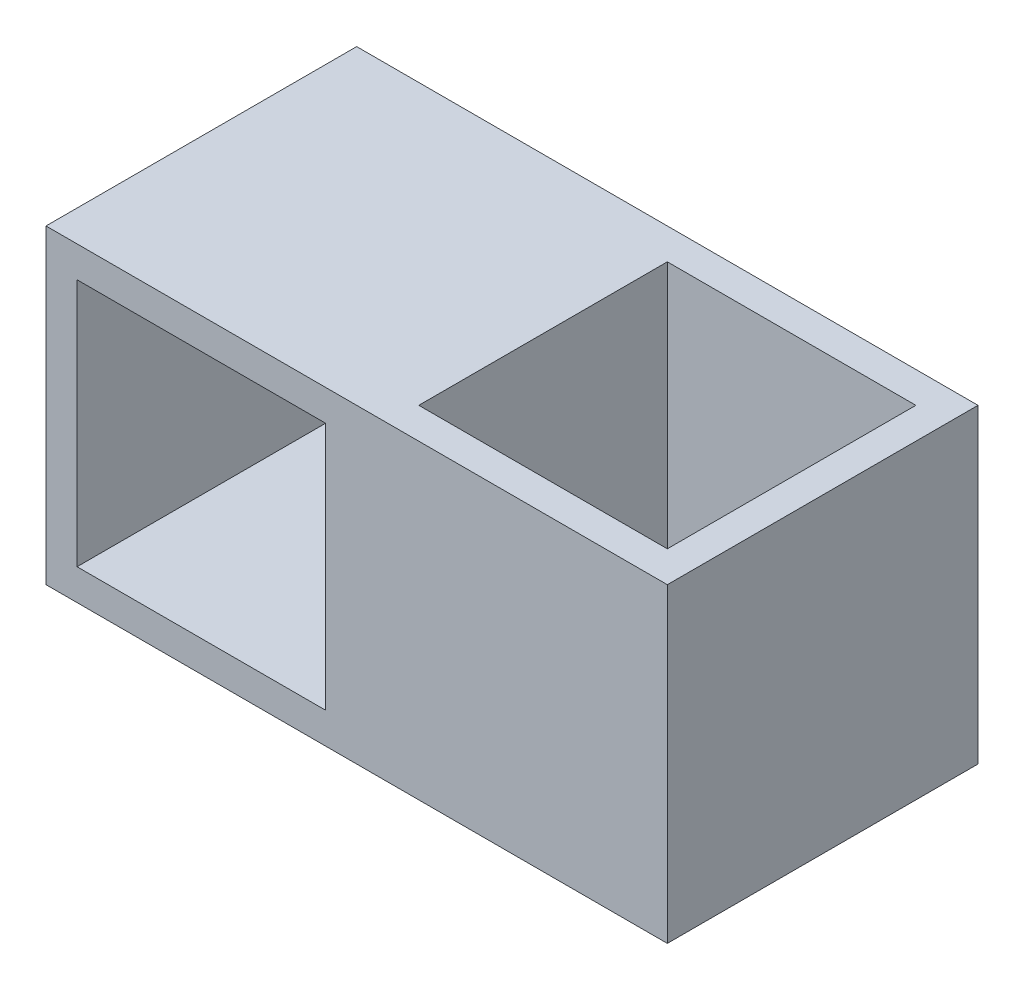
ISO-10303-21;
HEADER;
FILE_DESCRIPTION(('STEP AP214'),'2;1');
FILE_NAME('part.step','',(''),(''),'','','');
FILE_SCHEMA(('AUTOMOTIVE_DESIGN { 1 0 10303 214 1 1 1 1 }'));
ENDSEC;
DATA;
#1=APPLICATION_CONTEXT('core data for automotive mechanical design processes');
#2=APPLICATION_PROTOCOL_DEFINITION('international standard','automotive_design',2000,#1);
#3=PRODUCT_CONTEXT('',#1,'mechanical');
#4=PRODUCT('Part','Part','',(#3));
#5=PRODUCT_RELATED_PRODUCT_CATEGORY('part','',(#4));
#6=PRODUCT_DEFINITION_FORMATION('','',#4);
#7=PRODUCT_DEFINITION_CONTEXT('part definition',#1,'design');
#8=PRODUCT_DEFINITION('design','',#6,#7);
#9=PRODUCT_DEFINITION_SHAPE('','',#8);
#10=(LENGTH_UNIT() NAMED_UNIT(*) SI_UNIT(.MILLI.,.METRE.));
#11=(NAMED_UNIT(*) PLANE_ANGLE_UNIT() SI_UNIT($,.RADIAN.));
#12=(NAMED_UNIT(*) SI_UNIT($,.STERADIAN.) SOLID_ANGLE_UNIT());
#13=UNCERTAINTY_MEASURE_WITH_UNIT(LENGTH_MEASURE(1.E-05),#10,'distance_accuracy_value','');
#14=(GEOMETRIC_REPRESENTATION_CONTEXT(3) GLOBAL_UNCERTAINTY_ASSIGNED_CONTEXT((#13)) GLOBAL_UNIT_ASSIGNED_CONTEXT((#10,
#11,#12)) REPRESENTATION_CONTEXT('',''));
#15=CARTESIAN_POINT('',(0.,0.,0.));
#16=DIRECTION('',(0.,0.,1.));
#17=DIRECTION('',(1.,0.,0.));
#18=AXIS2_PLACEMENT_3D('',#15,#16,#17);
#19=CARTESIAN_POINT('',(-50.,-25.,50.));
#20=DIRECTION('',(1.,0.,0.));
#21=DIRECTION('',(0.,0.,-1.));
#22=AXIS2_PLACEMENT_3D('',#19,#20,#21);
#23=PLANE('',#22);
#24=DIRECTION('',(0.,-1.,0.));
#25=VECTOR('',#24,1.);
#26=CARTESIAN_POINT('',(-50.,-25.,0.));
#27=LINE('',#26,#25);
#28=CARTESIAN_POINT('',(-50.,25.,0.));
#29=VERTEX_POINT('',#28);
#30=CARTESIAN_POINT('',(-50.,-25.,0.));
#31=VERTEX_POINT('',#30);
#32=EDGE_CURVE('E218',#29,#31,#27,.T.);
#33=ORIENTED_EDGE('',*,*,#32,.T.);
#34=DIRECTION('',(0.,0.,-1.));
#35=VECTOR('',#34,1.);
#36=CARTESIAN_POINT('',(-50.,-25.,50.));
#37=LINE('',#36,#35);
#38=CARTESIAN_POINT('',(-50.,-25.,50.));
#39=VERTEX_POINT('',#38);
#40=EDGE_CURVE('E11',#39,#31,#37,.T.);
#41=ORIENTED_EDGE('',*,*,#40,.F.);
#42=DIRECTION('',(0.,-1.,0.));
#43=VECTOR('',#42,1.);
#44=CARTESIAN_POINT('',(-50.,-25.,50.));
#45=LINE('',#44,#43);
#46=CARTESIAN_POINT('',(-50.,25.,50.));
#47=VERTEX_POINT('',#46);
#48=EDGE_CURVE('E219',#47,#39,#45,.T.);
#49=ORIENTED_EDGE('',*,*,#48,.F.);
#50=DIRECTION('',(0.,0.,-1.));
#51=VECTOR('',#50,1.);
#52=CARTESIAN_POINT('',(-50.,25.,50.));
#53=LINE('',#52,#51);
#54=EDGE_CURVE('E233',#47,#29,#53,.T.);
#55=ORIENTED_EDGE('',*,*,#54,.T.);
#56=EDGE_LOOP('',(#33,#41,#49,#55));
#57=FACE_BOUND('',#56,.T.);
#58=ADVANCED_FACE('F39',(#57),#23,.F.);
#59=CARTESIAN_POINT('',(50.,-25.,50.));
#60=DIRECTION('',(0.,1.,0.));
#61=DIRECTION('',(-1.,0.,0.));
#62=AXIS2_PLACEMENT_3D('',#59,#60,#61);
#63=PLANE('',#62);
#64=DIRECTION('',(1.,0.,0.));
#65=VECTOR('',#64,1.);
#66=CARTESIAN_POINT('',(45.,-25.,5.));
#67=LINE('',#66,#65);
#68=CARTESIAN_POINT('',(5.00000000000002,-25.,4.99999999999999));
#69=VERTEX_POINT('',#68);
#70=CARTESIAN_POINT('',(45.,-25.,5.));
#71=VERTEX_POINT('',#70);
#72=EDGE_CURVE('E189',#69,#71,#67,.T.);
#73=ORIENTED_EDGE('',*,*,#72,.F.);
#74=DIRECTION('',(0.,0.,-1.));
#75=VECTOR('',#74,1.);
#76=CARTESIAN_POINT('',(5.00000000000002,-25.,4.99999999999999));
#77=LINE('',#76,#75);
#78=CARTESIAN_POINT('',(5.00000000000002,-25.,45.));
#79=VERTEX_POINT('',#78);
#80=EDGE_CURVE('E186',#79,#69,#77,.T.);
#81=ORIENTED_EDGE('',*,*,#80,.F.);
#82=DIRECTION('',(-1.,0.,0.));
#83=VECTOR('',#82,1.);
#84=CARTESIAN_POINT('',(45.,-25.,45.));
#85=LINE('',#84,#83);
#86=CARTESIAN_POINT('',(45.,-25.,45.));
#87=VERTEX_POINT('',#86);
#88=EDGE_CURVE('E197',#87,#79,#85,.T.);
#89=ORIENTED_EDGE('',*,*,#88,.F.);
#90=DIRECTION('',(0.,0.,1.));
#91=VECTOR('',#90,1.);
#92=CARTESIAN_POINT('',(45.,-25.,5.));
#93=LINE('',#92,#91);
#94=EDGE_CURVE('E193',#71,#87,#93,.T.);
#95=ORIENTED_EDGE('',*,*,#94,.F.);
#96=EDGE_LOOP('',(#73,#81,#89,#95));
#97=FACE_BOUND('',#96,.T.);
#98=DIRECTION('',(1.,0.,0.));
#99=VECTOR('',#98,1.);
#100=CARTESIAN_POINT('',(50.,-25.,0.));
#101=LINE('',#100,#99);
#102=CARTESIAN_POINT('',(50.,-25.,0.));
#103=VERTEX_POINT('',#102);
#104=EDGE_CURVE('E237',#31,#103,#101,.T.);
#105=ORIENTED_EDGE('',*,*,#104,.T.);
#106=DIRECTION('',(0.,0.,-1.));
#107=VECTOR('',#106,1.);
#108=CARTESIAN_POINT('',(50.,-25.,50.));
#109=LINE('',#108,#107);
#110=CARTESIAN_POINT('',(50.,-25.,50.));
#111=VERTEX_POINT('',#110);
#112=EDGE_CURVE('E47',#111,#103,#109,.T.);
#113=ORIENTED_EDGE('',*,*,#112,.F.);
#114=DIRECTION('',(1.,0.,0.));
#115=VECTOR('',#114,1.);
#116=CARTESIAN_POINT('',(50.,-25.,50.));
#117=LINE('',#116,#115);
#118=EDGE_CURVE('E223',#39,#111,#117,.T.);
#119=ORIENTED_EDGE('',*,*,#118,.F.);
#120=ORIENTED_EDGE('',*,*,#40,.T.);
#121=EDGE_LOOP('',(#105,#113,#119,#120));
#122=FACE_BOUND('',#121,.T.);
#123=ADVANCED_FACE('F271',(#97,#122),#63,.F.);
#124=CARTESIAN_POINT('',(50.,-25.,50.));
#125=DIRECTION('',(-1.,0.,0.));
#126=DIRECTION('',(0.,-1.,0.));
#127=AXIS2_PLACEMENT_3D('',#124,#125,#126);
#128=PLANE('',#127);
#129=DIRECTION('',(0.,1.,0.));
#130=VECTOR('',#129,1.);
#131=CARTESIAN_POINT('',(50.,-25.,0.));
#132=LINE('',#131,#130);
#133=CARTESIAN_POINT('',(50.,25.,0.));
#134=VERTEX_POINT('',#133);
#135=EDGE_CURVE('E240',#103,#134,#132,.T.);
#136=ORIENTED_EDGE('',*,*,#135,.T.);
#137=DIRECTION('',(0.,0.,-1.));
#138=VECTOR('',#137,1.);
#139=CARTESIAN_POINT('',(50.,25.,50.));
#140=LINE('',#139,#138);
#141=CARTESIAN_POINT('',(50.,25.,50.));
#142=VERTEX_POINT('',#141);
#143=EDGE_CURVE('E248',#142,#134,#140,.T.);
#144=ORIENTED_EDGE('',*,*,#143,.F.);
#145=DIRECTION('',(0.,1.,0.));
#146=VECTOR('',#145,1.);
#147=CARTESIAN_POINT('',(50.,-25.,50.));
#148=LINE('',#147,#146);
#149=EDGE_CURVE('E227',#111,#142,#148,.T.);
#150=ORIENTED_EDGE('',*,*,#149,.F.);
#151=ORIENTED_EDGE('',*,*,#112,.T.);
#152=EDGE_LOOP('',(#136,#144,#150,#151));
#153=FACE_BOUND('',#152,.T.);
#154=ADVANCED_FACE('F257',(#153),#128,.F.);
#155=CARTESIAN_POINT('',(50.,25.,50.));
#156=DIRECTION('',(0.,-1.,0.));
#157=DIRECTION('',(1.,0.,0.));
#158=AXIS2_PLACEMENT_3D('',#155,#156,#157);
#159=PLANE('',#158);
#160=DIRECTION('',(1.,0.,0.));
#161=VECTOR('',#160,1.);
#162=CARTESIAN_POINT('',(45.,25.,45.));
#163=LINE('',#162,#161);
#164=CARTESIAN_POINT('',(5.00000000000002,25.,45.));
#165=VERTEX_POINT('',#164);
#166=CARTESIAN_POINT('',(45.,25.,45.));
#167=VERTEX_POINT('',#166);
#168=EDGE_CURVE('E178',#165,#167,#163,.T.);
#169=ORIENTED_EDGE('',*,*,#168,.F.);
#170=DIRECTION('',(0.,0.,1.));
#171=VECTOR('',#170,1.);
#172=CARTESIAN_POINT('',(5.00000000000002,25.,4.99999999999999));
#173=LINE('',#172,#171);
#174=CARTESIAN_POINT('',(5.00000000000002,25.,4.99999999999999));
#175=VERTEX_POINT('',#174);
#176=EDGE_CURVE('E182',#175,#165,#173,.T.);
#177=ORIENTED_EDGE('',*,*,#176,.F.);
#178=DIRECTION('',(-1.,0.,0.));
#179=VECTOR('',#178,1.);
#180=CARTESIAN_POINT('',(45.,25.,5.));
#181=LINE('',#180,#179);
#182=CARTESIAN_POINT('',(45.,25.,5.));
#183=VERTEX_POINT('',#182);
#184=EDGE_CURVE('E205',#183,#175,#181,.T.);
#185=ORIENTED_EDGE('',*,*,#184,.F.);
#186=DIRECTION('',(0.,0.,-1.));
#187=VECTOR('',#186,1.);
#188=CARTESIAN_POINT('',(45.,25.,5.));
#189=LINE('',#188,#187);
#190=EDGE_CURVE('E144',#167,#183,#189,.T.);
#191=ORIENTED_EDGE('',*,*,#190,.F.);
#192=EDGE_LOOP('',(#169,#177,#185,#191));
#193=FACE_BOUND('',#192,.T.);
#194=DIRECTION('',(-1.,0.,0.));
#195=VECTOR('',#194,1.);
#196=CARTESIAN_POINT('',(50.,25.,0.));
#197=LINE('',#196,#195);
#198=EDGE_CURVE('E224',#134,#29,#197,.T.);
#199=ORIENTED_EDGE('',*,*,#198,.T.);
#200=ORIENTED_EDGE('',*,*,#54,.F.);
#201=DIRECTION('',(-1.,0.,0.));
#202=VECTOR('',#201,1.);
#203=CARTESIAN_POINT('',(50.,25.,50.));
#204=LINE('',#203,#202);
#205=EDGE_CURVE('E230',#142,#47,#204,.T.);
#206=ORIENTED_EDGE('',*,*,#205,.F.);
#207=ORIENTED_EDGE('',*,*,#143,.T.);
#208=EDGE_LOOP('',(#199,#200,#206,#207));
#209=FACE_BOUND('',#208,.T.);
#210=ADVANCED_FACE('F264',(#193,#209),#159,.F.);
#211=CARTESIAN_POINT('',(0.,0.,50.));
#212=DIRECTION('',(0.,0.,1.));
#213=DIRECTION('',(1.,0.,0.));
#214=AXIS2_PLACEMENT_3D('',#211,#212,#213);
#215=PLANE('',#214);
#216=DIRECTION('',(0.,-1.,0.));
#217=VECTOR('',#216,1.);
#218=CARTESIAN_POINT('',(-45.,20.,50.));
#219=LINE('',#218,#217);
#220=CARTESIAN_POINT('',(-45.,20.,50.));
#221=VERTEX_POINT('',#220);
#222=CARTESIAN_POINT('',(-45.,-20.,50.));
#223=VERTEX_POINT('',#222);
#224=EDGE_CURVE('E54',#221,#223,#219,.T.);
#225=ORIENTED_EDGE('',*,*,#224,.F.);
#226=DIRECTION('',(-1.,0.,0.));
#227=VECTOR('',#226,1.);
#228=CARTESIAN_POINT('',(-4.99999999999998,20.,50.));
#229=LINE('',#228,#227);
#230=CARTESIAN_POINT('',(-4.99999999999998,20.,50.));
#231=VERTEX_POINT('',#230);
#232=EDGE_CURVE('E137',#231,#221,#229,.T.);
#233=ORIENTED_EDGE('',*,*,#232,.F.);
#234=DIRECTION('',(0.,1.,0.));
#235=VECTOR('',#234,1.);
#236=CARTESIAN_POINT('',(-4.99999999999998,20.,50.));
#237=LINE('',#236,#235);
#238=CARTESIAN_POINT('',(-4.99999999999998,-20.,50.));
#239=VERTEX_POINT('',#238);
#240=EDGE_CURVE('E162',#239,#231,#237,.T.);
#241=ORIENTED_EDGE('',*,*,#240,.F.);
#242=DIRECTION('',(1.,0.,0.));
#243=VECTOR('',#242,1.);
#244=CARTESIAN_POINT('',(-4.99999999999998,-20.,50.));
#245=LINE('',#244,#243);
#246=EDGE_CURVE('E155',#223,#239,#245,.T.);
#247=ORIENTED_EDGE('',*,*,#246,.F.);
#248=EDGE_LOOP('',(#225,#233,#241,#247));
#249=FACE_BOUND('',#248,.T.);
#250=ORIENTED_EDGE('',*,*,#48,.T.);
#251=ORIENTED_EDGE('',*,*,#118,.T.);
#252=ORIENTED_EDGE('',*,*,#149,.T.);
#253=ORIENTED_EDGE('',*,*,#205,.T.);
#254=EDGE_LOOP('',(#250,#251,#252,#253));
#255=FACE_BOUND('',#254,.T.);
#256=ADVANCED_FACE('F270',(#249,#255),#215,.T.);
#257=CARTESIAN_POINT('',(0.,0.,0.));
#258=DIRECTION('',(0.,0.,1.));
#259=DIRECTION('',(1.,0.,0.));
#260=AXIS2_PLACEMENT_3D('',#257,#258,#259);
#261=PLANE('',#260);
#262=DIRECTION('',(1.,0.,0.));
#263=VECTOR('',#262,1.);
#264=CARTESIAN_POINT('',(-4.99999999999998,20.,0.));
#265=LINE('',#264,#263);
#266=CARTESIAN_POINT('',(-45.,20.,0.));
#267=VERTEX_POINT('',#266);
#268=CARTESIAN_POINT('',(-4.99999999999998,20.,0.));
#269=VERTEX_POINT('',#268);
#270=EDGE_CURVE('E150',#267,#269,#265,.T.);
#271=ORIENTED_EDGE('',*,*,#270,.F.);
#272=DIRECTION('',(0.,1.,0.));
#273=VECTOR('',#272,1.);
#274=CARTESIAN_POINT('',(-45.,20.,0.));
#275=LINE('',#274,#273);
#276=CARTESIAN_POINT('',(-45.,-20.,0.));
#277=VERTEX_POINT('',#276);
#278=EDGE_CURVE('E130',#277,#267,#275,.T.);
#279=ORIENTED_EDGE('',*,*,#278,.F.);
#280=DIRECTION('',(-1.,0.,0.));
#281=VECTOR('',#280,1.);
#282=CARTESIAN_POINT('',(-4.99999999999998,-20.,0.));
#283=LINE('',#282,#281);
#284=CARTESIAN_POINT('',(-4.99999999999998,-20.,0.));
#285=VERTEX_POINT('',#284);
#286=EDGE_CURVE('E140',#285,#277,#283,.T.);
#287=ORIENTED_EDGE('',*,*,#286,.F.);
#288=DIRECTION('',(0.,-1.,0.));
#289=VECTOR('',#288,1.);
#290=CARTESIAN_POINT('',(-4.99999999999998,20.,0.));
#291=LINE('',#290,#289);
#292=EDGE_CURVE('E62',#269,#285,#291,.T.);
#293=ORIENTED_EDGE('',*,*,#292,.F.);
#294=EDGE_LOOP('',(#271,#279,#287,#293));
#295=FACE_BOUND('',#294,.T.);
#296=ORIENTED_EDGE('',*,*,#32,.F.);
#297=ORIENTED_EDGE('',*,*,#198,.F.);
#298=ORIENTED_EDGE('',*,*,#135,.F.);
#299=ORIENTED_EDGE('',*,*,#104,.F.);
#300=EDGE_LOOP('',(#296,#297,#298,#299));
#301=FACE_BOUND('',#300,.T.);
#302=ADVANCED_FACE('F147',(#295,#301),#261,.F.);
#303=CARTESIAN_POINT('',(5.00000000000002,25.001,4.99999999999999));
#304=DIRECTION('',(-1.,0.,0.));
#305=DIRECTION('',(0.,-1.,0.));
#306=AXIS2_PLACEMENT_3D('',#303,#304,#305);
#307=PLANE('',#306);
#308=ORIENTED_EDGE('',*,*,#176,.T.);
#309=DIRECTION('',(0.,-1.,0.));
#310=VECTOR('',#309,1.);
#311=CARTESIAN_POINT('',(5.00000000000002,25.001,45.));
#312=LINE('',#311,#310);
#313=EDGE_CURVE('E202',#165,#79,#312,.T.);
#314=ORIENTED_EDGE('',*,*,#313,.T.);
#315=ORIENTED_EDGE('',*,*,#80,.T.);
#316=DIRECTION('',(0.,-1.,0.));
#317=VECTOR('',#316,1.);
#318=CARTESIAN_POINT('',(5.00000000000002,25.001,4.99999999999999));
#319=LINE('',#318,#317);
#320=EDGE_CURVE('E201',#175,#69,#319,.T.);
#321=ORIENTED_EDGE('',*,*,#320,.F.);
#322=EDGE_LOOP('',(#308,#314,#315,#321));
#323=FACE_BOUND('',#322,.T.);
#324=ADVANCED_FACE('F286',(#323),#307,.F.);
#325=CARTESIAN_POINT('',(45.,25.001,45.));
#326=DIRECTION('',(0.,0.,1.));
#327=DIRECTION('',(1.,0.,0.));
#328=AXIS2_PLACEMENT_3D('',#325,#326,#327);
#329=PLANE('',#328);
#330=ORIENTED_EDGE('',*,*,#168,.T.);
#331=DIRECTION('',(0.,-1.,0.));
#332=VECTOR('',#331,1.);
#333=CARTESIAN_POINT('',(45.,25.001,45.));
#334=LINE('',#333,#332);
#335=EDGE_CURVE('E206',#167,#87,#334,.T.);
#336=ORIENTED_EDGE('',*,*,#335,.T.);
#337=ORIENTED_EDGE('',*,*,#88,.T.);
#338=ORIENTED_EDGE('',*,*,#313,.F.);
#339=EDGE_LOOP('',(#330,#336,#337,#338));
#340=FACE_BOUND('',#339,.T.);
#341=ADVANCED_FACE('F292',(#340),#329,.F.);
#342=CARTESIAN_POINT('',(45.,25.001,5.));
#343=DIRECTION('',(1.,0.,0.));
#344=DIRECTION('',(0.,1.,0.));
#345=AXIS2_PLACEMENT_3D('',#342,#343,#344);
#346=PLANE('',#345);
#347=ORIENTED_EDGE('',*,*,#190,.T.);
#348=DIRECTION('',(0.,-1.,0.));
#349=VECTOR('',#348,1.);
#350=CARTESIAN_POINT('',(45.,25.001,5.));
#351=LINE('',#350,#349);
#352=EDGE_CURVE('E209',#183,#71,#351,.T.);
#353=ORIENTED_EDGE('',*,*,#352,.T.);
#354=ORIENTED_EDGE('',*,*,#94,.T.);
#355=ORIENTED_EDGE('',*,*,#335,.F.);
#356=EDGE_LOOP('',(#347,#353,#354,#355));
#357=FACE_BOUND('',#356,.T.);
#358=ADVANCED_FACE('F297',(#357),#346,.F.);
#359=CARTESIAN_POINT('',(45.,25.001,5.));
#360=DIRECTION('',(0.,0.,-1.));
#361=DIRECTION('',(-1.,0.,0.));
#362=AXIS2_PLACEMENT_3D('',#359,#360,#361);
#363=PLANE('',#362);
#364=ORIENTED_EDGE('',*,*,#184,.T.);
#365=ORIENTED_EDGE('',*,*,#320,.T.);
#366=ORIENTED_EDGE('',*,*,#72,.T.);
#367=ORIENTED_EDGE('',*,*,#352,.F.);
#368=EDGE_LOOP('',(#364,#365,#366,#367));
#369=FACE_BOUND('',#368,.T.);
#370=ADVANCED_FACE('F294',(#369),#363,.F.);
#371=CARTESIAN_POINT('',(-45.,20.,-0.001000000000001));
#372=DIRECTION('',(-1.,0.,0.));
#373=DIRECTION('',(0.,-1.,0.));
#374=AXIS2_PLACEMENT_3D('',#371,#372,#373);
#375=PLANE('',#374);
#376=ORIENTED_EDGE('',*,*,#278,.T.);
#377=DIRECTION('',(0.,0.,1.));
#378=VECTOR('',#377,1.);
#379=CARTESIAN_POINT('',(-45.,20.,-0.001000000000001));
#380=LINE('',#379,#378);
#381=EDGE_CURVE('E145',#267,#221,#380,.T.);
#382=ORIENTED_EDGE('',*,*,#381,.T.);
#383=ORIENTED_EDGE('',*,*,#224,.T.);
#384=DIRECTION('',(0.,0.,1.));
#385=VECTOR('',#384,1.);
#386=CARTESIAN_POINT('',(-45.,-20.,-0.001000000000001));
#387=LINE('',#386,#385);
#388=EDGE_CURVE('E126',#277,#223,#387,.T.);
#389=ORIENTED_EDGE('',*,*,#388,.F.);
#390=EDGE_LOOP('',(#376,#382,#383,#389));
#391=FACE_BOUND('',#390,.T.);
#392=ADVANCED_FACE('F128',(#391),#375,.F.);
#393=CARTESIAN_POINT('',(-4.99999999999998,20.,-0.001000000000001));
#394=DIRECTION('',(0.,1.,0.));
#395=DIRECTION('',(-1.,0.,0.));
#396=AXIS2_PLACEMENT_3D('',#393,#394,#395);
#397=PLANE('',#396);
#398=ORIENTED_EDGE('',*,*,#270,.T.);
#399=DIRECTION('',(0.,0.,1.));
#400=VECTOR('',#399,1.);
#401=CARTESIAN_POINT('',(-4.99999999999998,20.,-0.001000000000001));
#402=LINE('',#401,#400);
#403=EDGE_CURVE('E171',#269,#231,#402,.T.);
#404=ORIENTED_EDGE('',*,*,#403,.T.);
#405=ORIENTED_EDGE('',*,*,#232,.T.);
#406=ORIENTED_EDGE('',*,*,#381,.F.);
#407=EDGE_LOOP('',(#398,#404,#405,#406));
#408=FACE_BOUND('',#407,.T.);
#409=ADVANCED_FACE('F307',(#408),#397,.F.);
#410=CARTESIAN_POINT('',(-4.99999999999998,20.,-0.001000000000001));
#411=DIRECTION('',(1.,0.,0.));
#412=DIRECTION('',(0.,1.,0.));
#413=AXIS2_PLACEMENT_3D('',#410,#411,#412);
#414=PLANE('',#413);
#415=ORIENTED_EDGE('',*,*,#292,.T.);
#416=DIRECTION('',(0.,0.,1.));
#417=VECTOR('',#416,1.);
#418=CARTESIAN_POINT('',(-4.99999999999998,-20.,-0.001000000000001));
#419=LINE('',#418,#417);
#420=EDGE_CURVE('E136',#285,#239,#419,.T.);
#421=ORIENTED_EDGE('',*,*,#420,.T.);
#422=ORIENTED_EDGE('',*,*,#240,.T.);
#423=ORIENTED_EDGE('',*,*,#403,.F.);
#424=EDGE_LOOP('',(#415,#421,#422,#423));
#425=FACE_BOUND('',#424,.T.);
#426=ADVANCED_FACE('F310',(#425),#414,.F.);
#427=CARTESIAN_POINT('',(-4.99999999999998,-20.,-0.001000000000001));
#428=DIRECTION('',(0.,-1.,0.));
#429=DIRECTION('',(1.,0.,0.));
#430=AXIS2_PLACEMENT_3D('',#427,#428,#429);
#431=PLANE('',#430);
#432=ORIENTED_EDGE('',*,*,#286,.T.);
#433=ORIENTED_EDGE('',*,*,#388,.T.);
#434=ORIENTED_EDGE('',*,*,#246,.T.);
#435=ORIENTED_EDGE('',*,*,#420,.F.);
#436=EDGE_LOOP('',(#432,#433,#434,#435));
#437=FACE_BOUND('',#436,.T.);
#438=ADVANCED_FACE('F141',(#437),#431,.F.);
#439=CLOSED_SHELL('',(#58,#123,#154,#210,#256,#302,#324,#341,#358,#370,#392,#409,#426,#438));
#440=MANIFOLD_SOLID_BREP('B2',#439);
#441=ADVANCED_BREP_SHAPE_REPRESENTATION('',(#18,#440),#14);
#442=SHAPE_DEFINITION_REPRESENTATION(#9,#441);
ENDSEC;
END-ISO-10303-21;
